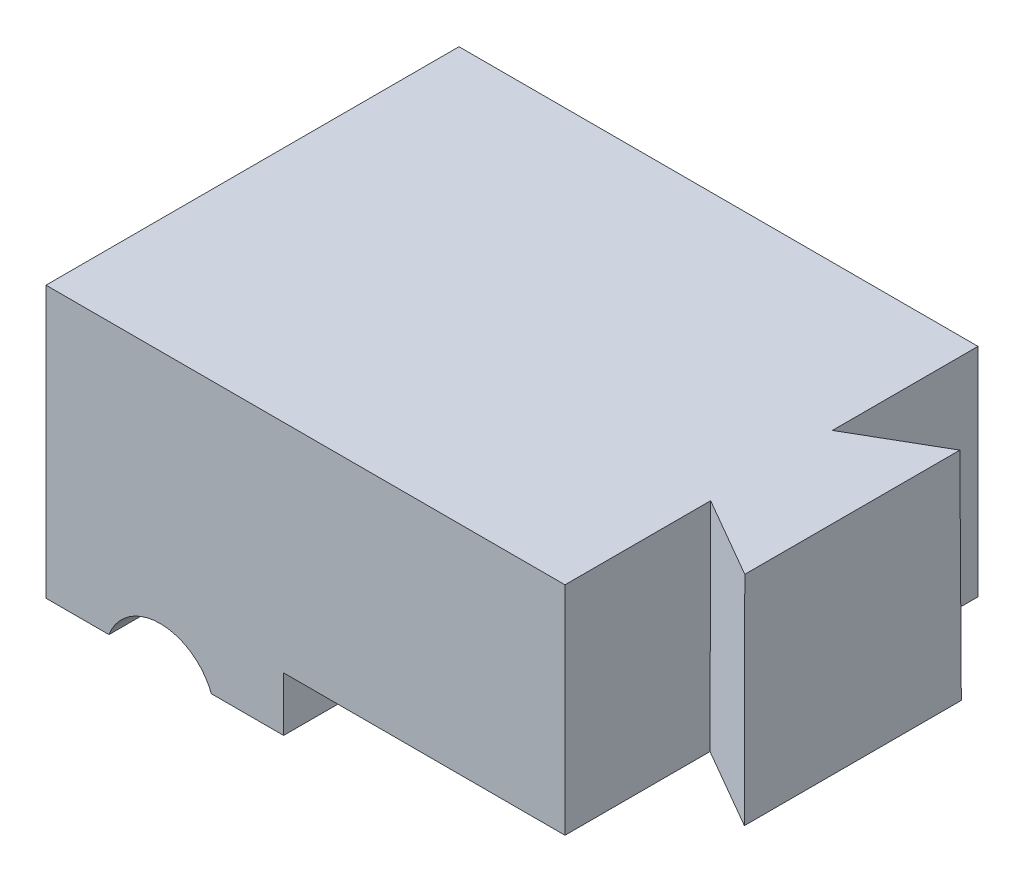
ISO-10303-21;
HEADER;
FILE_DESCRIPTION(('STEP AP214'),'2;1');
FILE_NAME('part.step','',(''),(''),'','','');
FILE_SCHEMA(('AUTOMOTIVE_DESIGN { 1 0 10303 214 1 1 1 1 }'));
ENDSEC;
DATA;
#1=APPLICATION_CONTEXT('core data for automotive mechanical design processes');
#2=APPLICATION_PROTOCOL_DEFINITION('international standard','automotive_design',2000,#1);
#3=PRODUCT_CONTEXT('',#1,'mechanical');
#4=PRODUCT('Part','Part','',(#3));
#5=PRODUCT_RELATED_PRODUCT_CATEGORY('part','',(#4));
#6=PRODUCT_DEFINITION_FORMATION('','',#4);
#7=PRODUCT_DEFINITION_CONTEXT('part definition',#1,'design');
#8=PRODUCT_DEFINITION('design','',#6,#7);
#9=PRODUCT_DEFINITION_SHAPE('','',#8);
#10=(LENGTH_UNIT() NAMED_UNIT(*) SI_UNIT(.MILLI.,.METRE.));
#11=(NAMED_UNIT(*) PLANE_ANGLE_UNIT() SI_UNIT($,.RADIAN.));
#12=(NAMED_UNIT(*) SI_UNIT($,.STERADIAN.) SOLID_ANGLE_UNIT());
#13=UNCERTAINTY_MEASURE_WITH_UNIT(LENGTH_MEASURE(1.E-05),#10,'distance_accuracy_value','');
#14=(GEOMETRIC_REPRESENTATION_CONTEXT(3) GLOBAL_UNCERTAINTY_ASSIGNED_CONTEXT((#13)) GLOBAL_UNIT_ASSIGNED_CONTEXT((#10,
#11,#12)) REPRESENTATION_CONTEXT('',''));
#15=CARTESIAN_POINT('',(0.,0.,0.));
#16=DIRECTION('',(0.,0.,1.));
#17=DIRECTION('',(1.,0.,0.));
#18=AXIS2_PLACEMENT_3D('',#15,#16,#17);
#19=CARTESIAN_POINT('',(0.,50.8,-134.33298));
#20=DIRECTION('',(0.,1.,0.));
#21=DIRECTION('',(0.,0.,1.));
#22=AXIS2_PLACEMENT_3D('',#19,#20,#21);
#23=PLANE('',#22);
#24=DIRECTION('',(0.866025403784436,0.,-0.500000000000004));
#25=VECTOR('',#24,1.);
#26=CARTESIAN_POINT('',(18.923,50.8,-111.157759547439));
#27=LINE('',#26,#25);
#28=CARTESIAN_POINT('',(0.,50.8,-100.232560403563));
#29=VERTEX_POINT('',#28);
#30=CARTESIAN_POINT('',(18.923,50.8,-111.157759547439));
#31=VERTEX_POINT('',#30);
#32=EDGE_CURVE('E243',#29,#31,#27,.T.);
#33=ORIENTED_EDGE('',*,*,#32,.F.);
#34=DIRECTION('',(0.,0.,1.));
#35=VECTOR('',#34,1.);
#36=CARTESIAN_POINT('',(0.,50.8,-37.62248));
#37=LINE('',#36,#35);
#38=CARTESIAN_POINT('',(0.,50.8,-134.33298));
#39=VERTEX_POINT('',#38);
#40=EDGE_CURVE('E113',#39,#29,#37,.T.);
#41=ORIENTED_EDGE('',*,*,#40,.F.);
#42=DIRECTION('',(1.,0.,0.));
#43=VECTOR('',#42,1.);
#44=CARTESIAN_POINT('',(0.,50.8,-134.33298));
#45=LINE('',#44,#43);
#46=CARTESIAN_POINT('',(-121.533574186181,50.8,-134.33298));
#47=VERTEX_POINT('',#46);
#48=EDGE_CURVE('E261',#47,#39,#45,.T.);
#49=ORIENTED_EDGE('',*,*,#48,.F.);
#50=DIRECTION('',(0.,0.,-1.));
#51=VECTOR('',#50,1.);
#52=CARTESIAN_POINT('',(-121.533574186181,50.8,-37.62248));
#53=LINE('',#52,#51);
#54=CARTESIAN_POINT('',(-121.533574186181,50.8,-37.62248));
#55=VERTEX_POINT('',#54);
#56=EDGE_CURVE('E264',#55,#47,#53,.T.);
#57=ORIENTED_EDGE('',*,*,#56,.F.);
#58=DIRECTION('',(-1.,0.,0.));
#59=VECTOR('',#58,1.);
#60=CARTESIAN_POINT('',(0.,50.8,-37.62248));
#61=LINE('',#60,#59);
#62=CARTESIAN_POINT('',(0.,50.8,-37.62248));
#63=VERTEX_POINT('',#62);
#64=EDGE_CURVE('E267',#63,#55,#61,.T.);
#65=ORIENTED_EDGE('',*,*,#64,.F.);
#66=CARTESIAN_POINT('',(0.,50.8,-71.7228995964367));
#67=VERTEX_POINT('',#66);
#68=EDGE_CURVE('E206',#67,#63,#37,.T.);
#69=ORIENTED_EDGE('',*,*,#68,.F.);
#70=DIRECTION('',(-0.866025403784436,0.,-0.500000000000005));
#71=VECTOR('',#70,1.);
#72=CARTESIAN_POINT('',(0.,50.8,-71.7228995964367));
#73=LINE('',#72,#71);
#74=CARTESIAN_POINT('',(18.923,50.8,-60.7977004525612));
#75=VERTEX_POINT('',#74);
#76=EDGE_CURVE('E209',#75,#67,#73,.T.);
#77=ORIENTED_EDGE('',*,*,#76,.F.);
#78=DIRECTION('',(0.,0.,1.));
#79=VECTOR('',#78,1.);
#80=CARTESIAN_POINT('',(18.923,50.8,-60.7977004525612));
#81=LINE('',#80,#79);
#82=EDGE_CURVE('E238',#31,#75,#81,.T.);
#83=ORIENTED_EDGE('',*,*,#82,.F.);
#84=EDGE_LOOP('',(#33,#41,#49,#57,#65,#69,#77,#83));
#85=FACE_BOUND('',#84,.T.);
#86=ADVANCED_FACE('F59',(#85),#23,.T.);
#87=CARTESIAN_POINT('',(0.,-12.7,-100.379207371938));
#88=DIRECTION('',(1.,0.,0.));
#89=DIRECTION('',(0.,0.,-1.));
#90=AXIS2_PLACEMENT_3D('',#87,#88,#89);
#91=PLANE('',#90);
#92=DIRECTION('',(0.,0.999995833359375,0.00288673931789312));
#93=VECTOR('',#92,1.);
#94=CARTESIAN_POINT('',(0.,0.,-100.379207371938));
#95=LINE('',#94,#93);
#96=CARTESIAN_POINT('',(0.,0.,-100.379207371938));
#97=VERTEX_POINT('',#96);
#98=EDGE_CURVE('E436',#97,#29,#95,.T.);
#99=ORIENTED_EDGE('',*,*,#98,.F.);
#100=DIRECTION('',(0.,0.,1.));
#101=VECTOR('',#100,1.);
#102=CARTESIAN_POINT('',(0.,0.,0.));
#103=LINE('',#102,#101);
#104=CARTESIAN_POINT('',(0.,0.,-134.33298));
#105=VERTEX_POINT('',#104);
#106=EDGE_CURVE('E97',#105,#97,#103,.T.);
#107=ORIENTED_EDGE('',*,*,#106,.F.);
#108=DIRECTION('',(0.,-1.,0.));
#109=VECTOR('',#108,1.);
#110=CARTESIAN_POINT('',(0.,0.,-134.33298));
#111=LINE('',#110,#109);
#112=EDGE_CURVE('E218',#39,#105,#111,.T.);
#113=ORIENTED_EDGE('',*,*,#112,.F.);
#114=ORIENTED_EDGE('',*,*,#40,.T.);
#115=EDGE_LOOP('',(#99,#107,#113,#114));
#116=FACE_BOUND('',#115,.T.);
#117=ADVANCED_FACE('F301',(#116),#91,.T.);
#118=CARTESIAN_POINT('',(0.,-12.7,-37.62248));
#119=DIRECTION('',(1.,0.,0.));
#120=DIRECTION('',(0.,0.,-1.));
#121=AXIS2_PLACEMENT_3D('',#118,#119,#120);
#122=PLANE('',#121);
#123=ORIENTED_EDGE('',*,*,#68,.T.);
#124=DIRECTION('',(0.,1.,0.));
#125=VECTOR('',#124,1.);
#126=CARTESIAN_POINT('',(0.,0.,-37.62248));
#127=LINE('',#126,#125);
#128=CARTESIAN_POINT('',(0.,0.,-37.62248));
#129=VERTEX_POINT('',#128);
#130=EDGE_CURVE('E174',#129,#63,#127,.T.);
#131=ORIENTED_EDGE('',*,*,#130,.F.);
#132=DIRECTION('',(0.,0.,1.));
#133=VECTOR('',#132,1.);
#134=CARTESIAN_POINT('',(0.,0.,0.));
#135=LINE('',#134,#133);
#136=CARTESIAN_POINT('',(0.,0.,-71.5762526280625));
#137=VERTEX_POINT('',#136);
#138=EDGE_CURVE('E196',#137,#129,#135,.T.);
#139=ORIENTED_EDGE('',*,*,#138,.F.);
#140=DIRECTION('',(0.,0.999995833359375,-0.00288673931789285));
#141=VECTOR('',#140,1.);
#142=CARTESIAN_POINT('',(0.,0.,-71.5762526280625));
#143=LINE('',#142,#141);
#144=EDGE_CURVE('E245',#137,#67,#143,.T.);
#145=ORIENTED_EDGE('',*,*,#144,.T.);
#146=EDGE_LOOP('',(#123,#131,#139,#145));
#147=FACE_BOUND('',#146,.T.);
#148=ADVANCED_FACE('F282',(#147),#122,.T.);
#149=CARTESIAN_POINT('',(0.,0.,-134.33298));
#150=DIRECTION('',(0.,0.,-1.));
#151=DIRECTION('',(-1.,0.,0.));
#152=AXIS2_PLACEMENT_3D('',#149,#150,#151);
#153=PLANE('',#152);
#154=ORIENTED_EDGE('',*,*,#48,.T.);
#155=ORIENTED_EDGE('',*,*,#112,.T.);
#156=DIRECTION('',(-1.,0.,0.));
#157=VECTOR('',#156,1.);
#158=CARTESIAN_POINT('',(419.1,0.,-134.33298));
#159=LINE('',#158,#157);
#160=CARTESIAN_POINT('',(-65.8864784217989,0.,-134.33298));
#161=VERTEX_POINT('',#160);
#162=EDGE_CURVE('E217',#105,#161,#159,.T.);
#163=ORIENTED_EDGE('',*,*,#162,.T.);
#164=DIRECTION('',(0.,1.,0.));
#165=VECTOR('',#164,1.);
#166=CARTESIAN_POINT('',(-65.8864784217989,-12.7,-134.33298));
#167=LINE('',#166,#165);
#168=CARTESIAN_POINT('',(-65.8864784217989,-12.7,-134.33298));
#169=VERTEX_POINT('',#168);
#170=EDGE_CURVE('E269',#169,#161,#167,.T.);
#171=ORIENTED_EDGE('',*,*,#170,.F.);
#172=DIRECTION('',(1.,0.,0.));
#173=VECTOR('',#172,1.);
#174=CARTESIAN_POINT('',(-121.533574186181,-12.7,-134.33298));
#175=LINE('',#174,#173);
#176=CARTESIAN_POINT('',(-82.8151756705354,-12.7,-134.33298));
#177=VERTEX_POINT('',#176);
#178=EDGE_CURVE('E190',#177,#169,#175,.T.);
#179=ORIENTED_EDGE('',*,*,#178,.F.);
#180=CARTESIAN_POINT('',(-94.7989161937078,-17.2740454822043,-134.33298));
#181=DIRECTION('',(0.,0.,-1.));
#182=DIRECTION('',(-1.,0.,0.));
#183=AXIS2_PLACEMENT_3D('',#180,#181,#182);
#184=CIRCLE('',#183,12.827);
#185=CARTESIAN_POINT('',(-106.78265671688,-12.7,-134.33298));
#186=VERTEX_POINT('',#185);
#187=EDGE_CURVE('E12',#186,#177,#184,.T.);
#188=ORIENTED_EDGE('',*,*,#187,.F.);
#189=CARTESIAN_POINT('',(-121.533574186181,-12.7,-134.33298));
#190=VERTEX_POINT('',#189);
#191=EDGE_CURVE('E173',#190,#186,#175,.T.);
#192=ORIENTED_EDGE('',*,*,#191,.F.);
#193=DIRECTION('',(0.,-1.,0.));
#194=VECTOR('',#193,1.);
#195=CARTESIAN_POINT('',(-121.533574186181,50.8,-134.33298));
#196=LINE('',#195,#194);
#197=EDGE_CURVE('E216',#47,#190,#196,.T.);
#198=ORIENTED_EDGE('',*,*,#197,.F.);
#199=EDGE_LOOP('',(#154,#155,#163,#171,#179,#188,#192,#198));
#200=FACE_BOUND('',#199,.T.);
#201=ADVANCED_FACE('F61',(#200),#153,.T.);
#202=CARTESIAN_POINT('',(0.,0.,0.));
#203=DIRECTION('',(0.,-1.,0.));
#204=DIRECTION('',(0.,0.,-1.));
#205=AXIS2_PLACEMENT_3D('',#202,#203,#204);
#206=PLANE('',#205);
#207=ORIENTED_EDGE('',*,*,#162,.F.);
#208=ORIENTED_EDGE('',*,*,#106,.T.);
#209=DIRECTION('',(0.866025403784436,0.,-0.500000000000004));
#210=VECTOR('',#209,1.);
#211=CARTESIAN_POINT('',(0.,0.,-100.379207371938));
#212=LINE('',#211,#210);
#213=CARTESIAN_POINT('',(19.05,0.,-111.37773));
#214=VERTEX_POINT('',#213);
#215=EDGE_CURVE('E226',#97,#214,#212,.T.);
#216=ORIENTED_EDGE('',*,*,#215,.T.);
#217=DIRECTION('',(0.,0.,-1.));
#218=VECTOR('',#217,1.);
#219=CARTESIAN_POINT('',(19.05,0.,0.));
#220=LINE('',#219,#218);
#221=CARTESIAN_POINT('',(19.05,0.,-60.57773));
#222=VERTEX_POINT('',#221);
#223=EDGE_CURVE('E231',#214,#222,#220,.F.);
#224=ORIENTED_EDGE('',*,*,#223,.T.);
#225=DIRECTION('',(-0.866025403784436,0.,-0.500000000000004));
#226=VECTOR('',#225,1.);
#227=CARTESIAN_POINT('',(19.05,0.,-60.57773));
#228=LINE('',#227,#226);
#229=EDGE_CURVE('E204',#222,#137,#228,.T.);
#230=ORIENTED_EDGE('',*,*,#229,.T.);
#231=ORIENTED_EDGE('',*,*,#138,.T.);
#232=DIRECTION('',(1.,0.,0.));
#233=VECTOR('',#232,1.);
#234=CARTESIAN_POINT('',(0.,0.,-37.62248));
#235=LINE('',#234,#233);
#236=CARTESIAN_POINT('',(-65.8864784217989,0.,-37.62248));
#237=VERTEX_POINT('',#236);
#238=EDGE_CURVE('E213',#237,#129,#235,.T.);
#239=ORIENTED_EDGE('',*,*,#238,.F.);
#240=DIRECTION('',(0.,0.,1.));
#241=VECTOR('',#240,1.);
#242=CARTESIAN_POINT('',(-65.8864784217989,0.,-37.62248));
#243=LINE('',#242,#241);
#244=EDGE_CURVE('E164',#161,#237,#243,.T.);
#245=ORIENTED_EDGE('',*,*,#244,.F.);
#246=EDGE_LOOP('',(#207,#208,#216,#224,#230,#231,#239,#245));
#247=FACE_BOUND('',#246,.T.);
#248=ADVANCED_FACE('F279',(#247),#206,.T.);
#249=CARTESIAN_POINT('',(0.,0.,-37.62248));
#250=DIRECTION('',(0.,0.,1.));
#251=DIRECTION('',(1.,0.,0.));
#252=AXIS2_PLACEMENT_3D('',#249,#250,#251);
#253=PLANE('',#252);
#254=ORIENTED_EDGE('',*,*,#238,.T.);
#255=ORIENTED_EDGE('',*,*,#130,.T.);
#256=ORIENTED_EDGE('',*,*,#64,.T.);
#257=DIRECTION('',(0.,-1.,0.));
#258=VECTOR('',#257,1.);
#259=CARTESIAN_POINT('',(-121.533574186181,50.8,-37.62248));
#260=LINE('',#259,#258);
#261=CARTESIAN_POINT('',(-121.533574186181,-12.7,-37.62248));
#262=VERTEX_POINT('',#261);
#263=EDGE_CURVE('E179',#55,#262,#260,.T.);
#264=ORIENTED_EDGE('',*,*,#263,.T.);
#265=DIRECTION('',(-1.,0.,0.));
#266=VECTOR('',#265,1.);
#267=CARTESIAN_POINT('',(-121.533574186181,-12.7,-37.62248));
#268=LINE('',#267,#266);
#269=CARTESIAN_POINT('',(-106.78265671688,-12.7,-37.62248));
#270=VERTEX_POINT('',#269);
#271=EDGE_CURVE('E170',#270,#262,#268,.T.);
#272=ORIENTED_EDGE('',*,*,#271,.F.);
#273=CARTESIAN_POINT('',(-94.7989161937078,-17.2740454822043,-37.62248));
#274=DIRECTION('',(0.,0.,1.));
#275=DIRECTION('',(1.,0.,0.));
#276=AXIS2_PLACEMENT_3D('',#273,#274,#275);
#277=CIRCLE('',#276,12.827);
#278=CARTESIAN_POINT('',(-82.8151756705354,-12.7,-37.62248));
#279=VERTEX_POINT('',#278);
#280=EDGE_CURVE('E69',#279,#270,#277,.T.);
#281=ORIENTED_EDGE('',*,*,#280,.F.);
#282=CARTESIAN_POINT('',(-65.8864784217989,-12.7,-37.62248));
#283=VERTEX_POINT('',#282);
#284=EDGE_CURVE('E182',#283,#279,#268,.T.);
#285=ORIENTED_EDGE('',*,*,#284,.F.);
#286=DIRECTION('',(0.,1.,0.));
#287=VECTOR('',#286,1.);
#288=CARTESIAN_POINT('',(-65.8864784217989,-12.7,-37.62248));
#289=LINE('',#288,#287);
#290=EDGE_CURVE('E185',#283,#237,#289,.T.);
#291=ORIENTED_EDGE('',*,*,#290,.T.);
#292=EDGE_LOOP('',(#254,#255,#256,#264,#272,#281,#285,#291));
#293=FACE_BOUND('',#292,.T.);
#294=ADVANCED_FACE('F177',(#293),#253,.T.);
#295=CARTESIAN_POINT('',(0.,-12.7,0.));
#296=DIRECTION('',(0.,-1.,0.));
#297=DIRECTION('',(0.,0.,-1.));
#298=AXIS2_PLACEMENT_3D('',#295,#296,#297);
#299=PLANE('',#298);
#300=DIRECTION('',(0.,0.,-1.));
#301=VECTOR('',#300,1.);
#302=CARTESIAN_POINT('',(-106.78265671688,-12.7,33.9832349236573));
#303=LINE('',#302,#301);
#304=EDGE_CURVE('E77',#270,#186,#303,.T.);
#305=ORIENTED_EDGE('',*,*,#304,.F.);
#306=ORIENTED_EDGE('',*,*,#271,.T.);
#307=DIRECTION('',(0.,0.,-1.));
#308=VECTOR('',#307,1.);
#309=CARTESIAN_POINT('',(-121.533574186181,-12.7,-37.62248));
#310=LINE('',#309,#308);
#311=EDGE_CURVE('E191',#262,#190,#310,.T.);
#312=ORIENTED_EDGE('',*,*,#311,.T.);
#313=ORIENTED_EDGE('',*,*,#191,.T.);
#314=EDGE_LOOP('',(#305,#306,#312,#313));
#315=FACE_BOUND('',#314,.T.);
#316=ADVANCED_FACE('F168',(#315),#299,.T.);
#317=CARTESIAN_POINT('',(-121.533574186181,50.8,-37.62248));
#318=DIRECTION('',(-1.,0.,0.));
#319=DIRECTION('',(0.,0.,1.));
#320=AXIS2_PLACEMENT_3D('',#317,#318,#319);
#321=PLANE('',#320);
#322=ORIENTED_EDGE('',*,*,#197,.T.);
#323=ORIENTED_EDGE('',*,*,#311,.F.);
#324=ORIENTED_EDGE('',*,*,#263,.F.);
#325=ORIENTED_EDGE('',*,*,#56,.T.);
#326=EDGE_LOOP('',(#322,#323,#324,#325));
#327=FACE_BOUND('',#326,.T.);
#328=ADVANCED_FACE('F289',(#327),#321,.T.);
#329=CARTESIAN_POINT('',(-65.8864784217989,-12.7,-37.62248));
#330=DIRECTION('',(-1.,0.,0.));
#331=DIRECTION('',(0.,0.,1.));
#332=AXIS2_PLACEMENT_3D('',#329,#330,#331);
#333=PLANE('',#332);
#334=ORIENTED_EDGE('',*,*,#244,.T.);
#335=ORIENTED_EDGE('',*,*,#290,.F.);
#336=DIRECTION('',(0.,0.,1.));
#337=VECTOR('',#336,1.);
#338=CARTESIAN_POINT('',(-65.8864784217989,-12.7,-37.62248));
#339=LINE('',#338,#337);
#340=EDGE_CURVE('E181',#169,#283,#339,.T.);
#341=ORIENTED_EDGE('',*,*,#340,.F.);
#342=ORIENTED_EDGE('',*,*,#170,.T.);
#343=EDGE_LOOP('',(#334,#335,#341,#342));
#344=FACE_BOUND('',#343,.T.);
#345=ADVANCED_FACE('F276',(#344),#333,.F.);
#346=DIRECTION('',(0.,0.,-1.));
#347=VECTOR('',#346,1.);
#348=CARTESIAN_POINT('',(-82.8151756705354,-12.7,33.9832349236573));
#349=LINE('',#348,#347);
#350=EDGE_CURVE('E159',#177,#279,#349,.F.);
#351=ORIENTED_EDGE('',*,*,#350,.F.);
#352=ORIENTED_EDGE('',*,*,#178,.T.);
#353=ORIENTED_EDGE('',*,*,#340,.T.);
#354=ORIENTED_EDGE('',*,*,#284,.T.);
#355=EDGE_LOOP('',(#351,#352,#353,#354));
#356=FACE_BOUND('',#355,.T.);
#357=ADVANCED_FACE('F292',(#356),#299,.T.);
#358=CARTESIAN_POINT('',(-94.7989161937078,-17.2740454822043,33.9832349236573));
#359=DIRECTION('',(0.,0.,-1.));
#360=DIRECTION('',(-1.,0.,0.));
#361=AXIS2_PLACEMENT_3D('',#358,#359,#360);
#362=CYLINDRICAL_SURFACE('',#361,12.827);
#363=ORIENTED_EDGE('',*,*,#304,.T.);
#364=ORIENTED_EDGE('',*,*,#187,.T.);
#365=ORIENTED_EDGE('',*,*,#350,.T.);
#366=ORIENTED_EDGE('',*,*,#280,.T.);
#367=EDGE_LOOP('',(#363,#364,#365,#366));
#368=FACE_BOUND('',#367,.T.);
#369=ADVANCED_FACE('F157',(#368),#362,.F.);
#370=CARTESIAN_POINT('',(-43.4652001404214,0.217326000702112,-75.2839350043589));
#371=DIRECTION('',(-0.499998437507328,0.0024999921875367,-0.866022697467735));
#372=DIRECTION('',(-0.866025403784436,0.,0.500000000000004));
#373=AXIS2_PLACEMENT_3D('',#370,#371,#372);
#374=PLANE('',#373);
#375=DIRECTION('',(-0.0024999687505859,0.99998750023437,0.0043300728933494));
#376=VECTOR('',#375,1.);
#377=CARTESIAN_POINT('',(19.05,0.,-111.37773));
#378=LINE('',#377,#376);
#379=EDGE_CURVE('E104',#214,#31,#378,.T.);
#380=ORIENTED_EDGE('',*,*,#379,.F.);
#381=ORIENTED_EDGE('',*,*,#215,.F.);
#382=ORIENTED_EDGE('',*,*,#98,.T.);
#383=ORIENTED_EDGE('',*,*,#32,.T.);
#384=EDGE_LOOP('',(#380,#381,#382,#383));
#385=FACE_BOUND('',#384,.T.);
#386=ADVANCED_FACE('F299',(#385),#374,.T.);
#387=CARTESIAN_POINT('',(19.0498809382442,0.0476247023456086,0.));
#388=DIRECTION('',(0.999996875014648,0.00249999218753653,0.));
#389=DIRECTION('',(-0.00249999218753653,0.999996875014648,0.));
#390=AXIS2_PLACEMENT_3D('',#387,#388,#389);
#391=PLANE('',#390);
#392=DIRECTION('',(-0.00249996875058583,0.99998750023437,-0.00433007289334913));
#393=VECTOR('',#392,1.);
#394=CARTESIAN_POINT('',(19.05,0.,-60.57773));
#395=LINE('',#394,#393);
#396=EDGE_CURVE('E249',#222,#75,#395,.T.);
#397=ORIENTED_EDGE('',*,*,#396,.F.);
#398=ORIENTED_EDGE('',*,*,#223,.F.);
#399=ORIENTED_EDGE('',*,*,#379,.T.);
#400=ORIENTED_EDGE('',*,*,#82,.T.);
#401=EDGE_LOOP('',(#397,#398,#399,#400));
#402=FACE_BOUND('',#401,.T.);
#403=ADVANCED_FACE('F321',(#402),#391,.T.);
#404=CARTESIAN_POINT('',(30.9932328340924,-0.154966164170464,-53.6818539594593));
#405=DIRECTION('',(-0.499998437507329,0.00249999218753668,0.866022697467735));
#406=DIRECTION('',(0.866025403784436,0.,0.500000000000005));
#407=AXIS2_PLACEMENT_3D('',#404,#405,#406);
#408=PLANE('',#407);
#409=ORIENTED_EDGE('',*,*,#144,.F.);
#410=ORIENTED_EDGE('',*,*,#229,.F.);
#411=ORIENTED_EDGE('',*,*,#396,.T.);
#412=ORIENTED_EDGE('',*,*,#76,.T.);
#413=EDGE_LOOP('',(#409,#410,#411,#412));
#414=FACE_BOUND('',#413,.T.);
#415=ADVANCED_FACE('F326',(#414),#408,.T.);
#416=CLOSED_SHELL('',(#86,#117,#148,#201,#248,#294,#316,#328,#345,#357,#369,#386,#403,#415));
#417=MANIFOLD_SOLID_BREP('B2',#416);
#418=ADVANCED_BREP_SHAPE_REPRESENTATION('',(#18,#417),#14);
#419=SHAPE_DEFINITION_REPRESENTATION(#9,#418);
ENDSEC;
END-ISO-10303-21;
